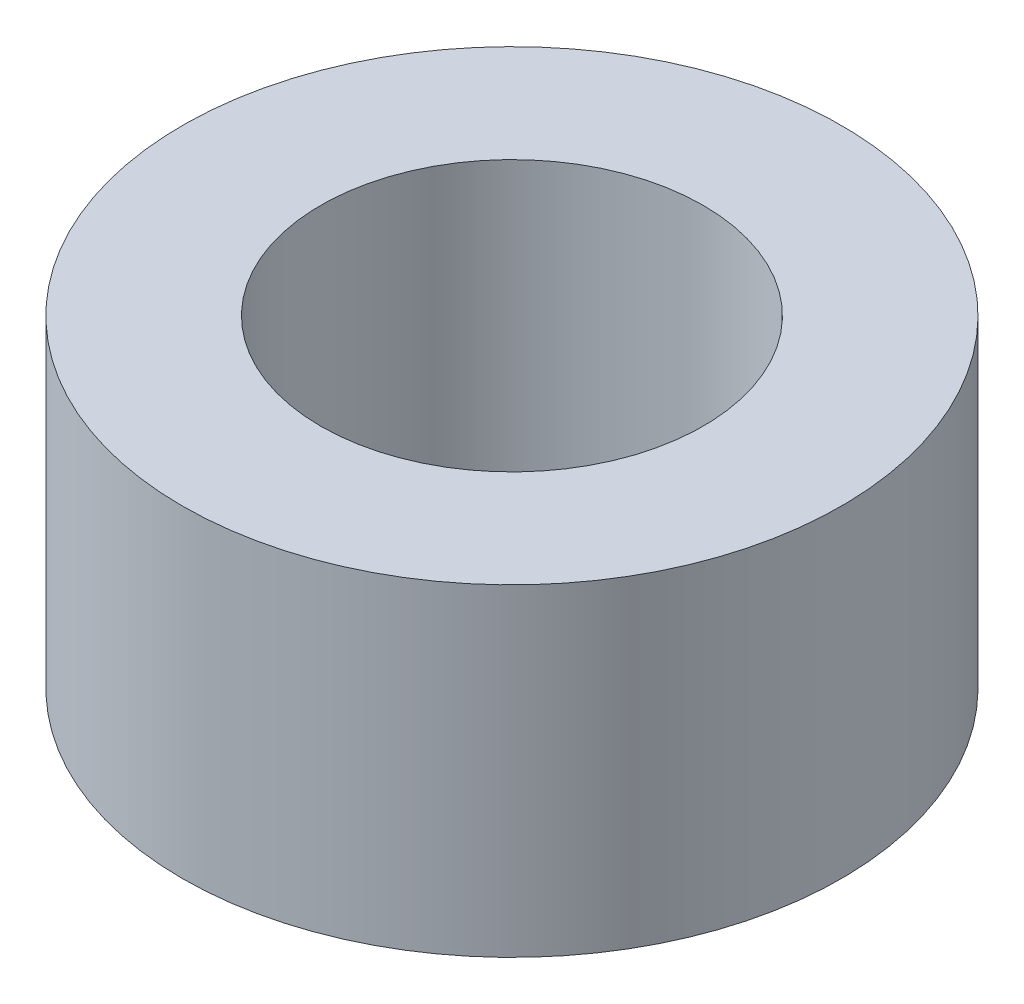
ISO-10303-21;
HEADER;
FILE_DESCRIPTION(('STEP AP214'),'2;1');
FILE_NAME('part.step','',(''),(''),'','','');
FILE_SCHEMA(('AUTOMOTIVE_DESIGN { 1 0 10303 214 1 1 1 1 }'));
ENDSEC;
DATA;
#1=APPLICATION_CONTEXT('core data for automotive mechanical design processes');
#2=APPLICATION_PROTOCOL_DEFINITION('international standard','automotive_design',2000,#1);
#3=PRODUCT_CONTEXT('',#1,'mechanical');
#4=PRODUCT('Part','Part','',(#3));
#5=PRODUCT_RELATED_PRODUCT_CATEGORY('part','',(#4));
#6=PRODUCT_DEFINITION_FORMATION('','',#4);
#7=PRODUCT_DEFINITION_CONTEXT('part definition',#1,'design');
#8=PRODUCT_DEFINITION('design','',#6,#7);
#9=PRODUCT_DEFINITION_SHAPE('','',#8);
#10=(LENGTH_UNIT() NAMED_UNIT(*) SI_UNIT(.MILLI.,.METRE.));
#11=(NAMED_UNIT(*) PLANE_ANGLE_UNIT() SI_UNIT($,.RADIAN.));
#12=(NAMED_UNIT(*) SI_UNIT($,.STERADIAN.) SOLID_ANGLE_UNIT());
#13=UNCERTAINTY_MEASURE_WITH_UNIT(LENGTH_MEASURE(1.E-05),#10,'distance_accuracy_value','');
#14=(GEOMETRIC_REPRESENTATION_CONTEXT(3) GLOBAL_UNCERTAINTY_ASSIGNED_CONTEXT((#13)) GLOBAL_UNIT_ASSIGNED_CONTEXT((#10,
#11,#12)) REPRESENTATION_CONTEXT('',''));
#15=CARTESIAN_POINT('',(0.,0.,0.));
#16=DIRECTION('',(0.,0.,1.));
#17=DIRECTION('',(1.,0.,0.));
#18=AXIS2_PLACEMENT_3D('',#15,#16,#17);
#19=CARTESIAN_POINT('',(0.,7.,0.));
#20=DIRECTION('',(0.,1.,0.));
#21=DIRECTION('',(0.,0.,1.));
#22=AXIS2_PLACEMENT_3D('',#19,#20,#21);
#23=PLANE('',#22);
#24=CARTESIAN_POINT('',(0.,7.,0.));
#25=DIRECTION('',(0.,1.,0.));
#26=DIRECTION('',(0.,0.,1.));
#27=AXIS2_PLACEMENT_3D('',#24,#25,#26);
#28=CIRCLE('',#27,7.15);
#29=CARTESIAN_POINT('',(0.,7.,7.15));
#30=VERTEX_POINT('',#29);
#31=EDGE_CURVE('E10',#30,#30,#28,.T.);
#32=ORIENTED_EDGE('',*,*,#31,.T.);
#33=EDGE_LOOP('',(#32));
#34=FACE_BOUND('',#33,.T.);
#35=CARTESIAN_POINT('',(0.,7.,0.));
#36=DIRECTION('',(0.,1.,0.));
#37=DIRECTION('',(0.,0.,1.));
#38=AXIS2_PLACEMENT_3D('',#35,#36,#37);
#39=CIRCLE('',#38,4.15);
#40=CARTESIAN_POINT('',(0.,7.,4.15));
#41=VERTEX_POINT('',#40);
#42=EDGE_CURVE('E50',#41,#41,#39,.T.);
#43=ORIENTED_EDGE('',*,*,#42,.F.);
#44=EDGE_LOOP('',(#43));
#45=FACE_BOUND('',#44,.T.);
#46=ADVANCED_FACE('F37',(#34,#45),#23,.T.);
#47=CARTESIAN_POINT('',(0.,0.,0.));
#48=DIRECTION('',(0.,1.,0.));
#49=DIRECTION('',(0.,0.,1.));
#50=AXIS2_PLACEMENT_3D('',#47,#48,#49);
#51=PLANE('',#50);
#52=CARTESIAN_POINT('',(0.,0.,0.));
#53=DIRECTION('',(0.,1.,0.));
#54=DIRECTION('',(0.,0.,1.));
#55=AXIS2_PLACEMENT_3D('',#52,#53,#54);
#56=CIRCLE('',#55,7.15);
#57=CARTESIAN_POINT('',(0.,0.,7.15));
#58=VERTEX_POINT('',#57);
#59=EDGE_CURVE('E41',#58,#58,#56,.T.);
#60=ORIENTED_EDGE('',*,*,#59,.F.);
#61=EDGE_LOOP('',(#60));
#62=FACE_BOUND('',#61,.T.);
#63=CARTESIAN_POINT('',(0.,0.,0.));
#64=DIRECTION('',(0.,1.,0.));
#65=DIRECTION('',(0.,0.,1.));
#66=AXIS2_PLACEMENT_3D('',#63,#64,#65);
#67=CIRCLE('',#66,4.15);
#68=CARTESIAN_POINT('',(0.,0.,4.15));
#69=VERTEX_POINT('',#68);
#70=EDGE_CURVE('E52',#69,#69,#67,.T.);
#71=ORIENTED_EDGE('',*,*,#70,.T.);
#72=EDGE_LOOP('',(#71));
#73=FACE_BOUND('',#72,.T.);
#74=ADVANCED_FACE('F64',(#62,#73),#51,.F.);
#75=CARTESIAN_POINT('',(0.,7.,0.));
#76=DIRECTION('',(0.,-1.,0.));
#77=DIRECTION('',(0.,0.,-1.));
#78=AXIS2_PLACEMENT_3D('',#75,#76,#77);
#79=CYLINDRICAL_SURFACE('',#78,7.15);
#80=ORIENTED_EDGE('',*,*,#31,.F.);
#81=EDGE_LOOP('',(#80));
#82=FACE_BOUND('',#81,.T.);
#83=ORIENTED_EDGE('',*,*,#59,.T.);
#84=EDGE_LOOP('',(#83));
#85=FACE_BOUND('',#84,.T.);
#86=ADVANCED_FACE('F39',(#82,#85),#79,.T.);
#87=CARTESIAN_POINT('',(0.,7.,0.));
#88=DIRECTION('',(0.,-1.,0.));
#89=DIRECTION('',(0.,0.,-1.));
#90=AXIS2_PLACEMENT_3D('',#87,#88,#89);
#91=CYLINDRICAL_SURFACE('',#90,4.15);
#92=ORIENTED_EDGE('',*,*,#42,.T.);
#93=EDGE_LOOP('',(#92));
#94=FACE_BOUND('',#93,.T.);
#95=ORIENTED_EDGE('',*,*,#70,.F.);
#96=EDGE_LOOP('',(#95));
#97=FACE_BOUND('',#96,.T.);
#98=ADVANCED_FACE('F60',(#94,#97),#91,.F.);
#99=CLOSED_SHELL('',(#46,#74,#86,#98));
#100=MANIFOLD_SOLID_BREP('B2',#99);
#101=ADVANCED_BREP_SHAPE_REPRESENTATION('',(#18,#100),#14);
#102=SHAPE_DEFINITION_REPRESENTATION(#9,#101);
ENDSEC;
END-ISO-10303-21;
